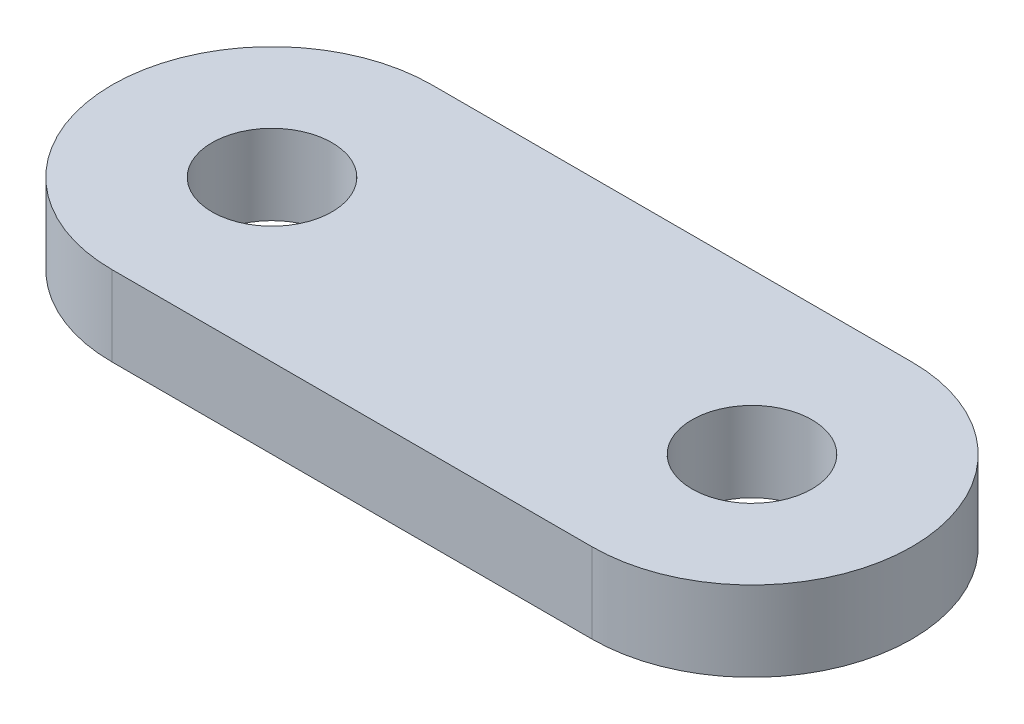
ISO-10303-21;
HEADER;
FILE_DESCRIPTION(('STEP AP214'),'2;1');
FILE_NAME('part.step','',(''),(''),'','','');
FILE_SCHEMA(('AUTOMOTIVE_DESIGN { 1 0 10303 214 1 1 1 1 }'));
ENDSEC;
DATA;
#1=APPLICATION_CONTEXT('core data for automotive mechanical design processes');
#2=APPLICATION_PROTOCOL_DEFINITION('international standard','automotive_design',2000,#1);
#3=PRODUCT_CONTEXT('',#1,'mechanical');
#4=PRODUCT('Part','Part','',(#3));
#5=PRODUCT_RELATED_PRODUCT_CATEGORY('part','',(#4));
#6=PRODUCT_DEFINITION_FORMATION('','',#4);
#7=PRODUCT_DEFINITION_CONTEXT('part definition',#1,'design');
#8=PRODUCT_DEFINITION('design','',#6,#7);
#9=PRODUCT_DEFINITION_SHAPE('','',#8);
#10=(LENGTH_UNIT() NAMED_UNIT(*) SI_UNIT(.MILLI.,.METRE.));
#11=(NAMED_UNIT(*) PLANE_ANGLE_UNIT() SI_UNIT($,.RADIAN.));
#12=(NAMED_UNIT(*) SI_UNIT($,.STERADIAN.) SOLID_ANGLE_UNIT());
#13=UNCERTAINTY_MEASURE_WITH_UNIT(LENGTH_MEASURE(1.E-05),#10,'distance_accuracy_value','');
#14=(GEOMETRIC_REPRESENTATION_CONTEXT(3) GLOBAL_UNCERTAINTY_ASSIGNED_CONTEXT((#13)) GLOBAL_UNIT_ASSIGNED_CONTEXT((#10,
#11,#12)) REPRESENTATION_CONTEXT('',''));
#15=CARTESIAN_POINT('',(0.,0.,0.));
#16=DIRECTION('',(0.,0.,1.));
#17=DIRECTION('',(1.,0.,0.));
#18=AXIS2_PLACEMENT_3D('',#15,#16,#17);
#19=CARTESIAN_POINT('',(-30.,10.,0.));
#20=DIRECTION('',(0.,1.,0.));
#21=DIRECTION('',(0.,0.,1.));
#22=AXIS2_PLACEMENT_3D('',#19,#20,#21);
#23=PLANE('',#22);
#24=CARTESIAN_POINT('',(-30.,10.,0.));
#25=DIRECTION('',(0.,1.,0.));
#26=DIRECTION('',(0.,0.,1.));
#27=AXIS2_PLACEMENT_3D('',#24,#25,#26);
#28=CIRCLE('',#27,7.5);
#29=CARTESIAN_POINT('',(-30.,10.,7.5));
#30=VERTEX_POINT('',#29);
#31=EDGE_CURVE('E103',#30,#30,#28,.T.);
#32=ORIENTED_EDGE('',*,*,#31,.F.);
#33=EDGE_LOOP('',(#32));
#34=FACE_BOUND('',#33,.T.);
#35=CARTESIAN_POINT('',(-30.,10.,0.));
#36=DIRECTION('',(0.,1.,0.));
#37=DIRECTION('',(0.,0.,1.));
#38=AXIS2_PLACEMENT_3D('',#35,#36,#37);
#39=CIRCLE('',#38,20.);
#40=CARTESIAN_POINT('',(-30.,10.,-20.));
#41=VERTEX_POINT('',#40);
#42=CARTESIAN_POINT('',(-30.,10.,20.));
#43=VERTEX_POINT('',#42);
#44=EDGE_CURVE('E88',#41,#43,#39,.T.);
#45=ORIENTED_EDGE('',*,*,#44,.T.);
#46=DIRECTION('',(1.,0.,0.));
#47=VECTOR('',#46,1.);
#48=CARTESIAN_POINT('',(30.,10.,20.));
#49=LINE('',#48,#47);
#50=CARTESIAN_POINT('',(30.,10.,20.));
#51=VERTEX_POINT('',#50);
#52=EDGE_CURVE('E83',#43,#51,#49,.T.);
#53=ORIENTED_EDGE('',*,*,#52,.T.);
#54=CARTESIAN_POINT('',(30.,10.,0.));
#55=DIRECTION('',(0.,1.,0.));
#56=DIRECTION('',(0.,0.,1.));
#57=AXIS2_PLACEMENT_3D('',#54,#55,#56);
#58=CIRCLE('',#57,20.);
#59=CARTESIAN_POINT('',(30.,10.,-20.));
#60=VERTEX_POINT('',#59);
#61=EDGE_CURVE('E86',#51,#60,#58,.T.);
#62=ORIENTED_EDGE('',*,*,#61,.T.);
#63=DIRECTION('',(-1.,0.,0.));
#64=VECTOR('',#63,1.);
#65=CARTESIAN_POINT('',(30.,10.,-20.));
#66=LINE('',#65,#64);
#67=EDGE_CURVE('E53',#60,#41,#66,.T.);
#68=ORIENTED_EDGE('',*,*,#67,.T.);
#69=EDGE_LOOP('',(#45,#53,#62,#68));
#70=FACE_BOUND('',#69,.T.);
#71=CARTESIAN_POINT('',(30.,10.,0.));
#72=DIRECTION('',(0.,1.,0.));
#73=DIRECTION('',(0.,0.,1.));
#74=AXIS2_PLACEMENT_3D('',#71,#72,#73);
#75=CIRCLE('',#74,7.5);
#76=CARTESIAN_POINT('',(30.,10.,7.5));
#77=VERTEX_POINT('',#76);
#78=EDGE_CURVE('E118',#77,#77,#75,.T.);
#79=ORIENTED_EDGE('',*,*,#78,.F.);
#80=EDGE_LOOP('',(#79));
#81=FACE_BOUND('',#80,.T.);
#82=ADVANCED_FACE('F36',(#34,#70,#81),#23,.T.);
#83=CARTESIAN_POINT('',(-30.,0.,0.));
#84=DIRECTION('',(0.,1.,0.));
#85=DIRECTION('',(0.,0.,1.));
#86=AXIS2_PLACEMENT_3D('',#83,#84,#85);
#87=PLANE('',#86);
#88=CARTESIAN_POINT('',(-30.,0.,0.));
#89=DIRECTION('',(0.,1.,0.));
#90=DIRECTION('',(0.,0.,1.));
#91=AXIS2_PLACEMENT_3D('',#88,#89,#90);
#92=CIRCLE('',#91,20.);
#93=CARTESIAN_POINT('',(-30.,0.,-20.));
#94=VERTEX_POINT('',#93);
#95=CARTESIAN_POINT('',(-30.,0.,20.));
#96=VERTEX_POINT('',#95);
#97=EDGE_CURVE('E100',#94,#96,#92,.T.);
#98=ORIENTED_EDGE('',*,*,#97,.F.);
#99=DIRECTION('',(-1.,0.,0.));
#100=VECTOR('',#99,1.);
#101=CARTESIAN_POINT('',(30.,0.,-20.));
#102=LINE('',#101,#100);
#103=CARTESIAN_POINT('',(30.,0.,-20.));
#104=VERTEX_POINT('',#103);
#105=EDGE_CURVE('E76',#104,#94,#102,.T.);
#106=ORIENTED_EDGE('',*,*,#105,.F.);
#107=CARTESIAN_POINT('',(30.,0.,0.));
#108=DIRECTION('',(0.,1.,0.));
#109=DIRECTION('',(0.,0.,1.));
#110=AXIS2_PLACEMENT_3D('',#107,#108,#109);
#111=CIRCLE('',#110,20.);
#112=CARTESIAN_POINT('',(30.,0.,20.));
#113=VERTEX_POINT('',#112);
#114=EDGE_CURVE('E70',#113,#104,#111,.T.);
#115=ORIENTED_EDGE('',*,*,#114,.F.);
#116=DIRECTION('',(1.,0.,0.));
#117=VECTOR('',#116,1.);
#118=CARTESIAN_POINT('',(30.,0.,20.));
#119=LINE('',#118,#117);
#120=EDGE_CURVE('E92',#96,#113,#119,.T.);
#121=ORIENTED_EDGE('',*,*,#120,.F.);
#122=EDGE_LOOP('',(#98,#106,#115,#121));
#123=FACE_BOUND('',#122,.T.);
#124=CARTESIAN_POINT('',(-30.,0.,0.));
#125=DIRECTION('',(0.,1.,0.));
#126=DIRECTION('',(0.,0.,1.));
#127=AXIS2_PLACEMENT_3D('',#124,#125,#126);
#128=CIRCLE('',#127,7.5);
#129=CARTESIAN_POINT('',(-30.,0.,7.5));
#130=VERTEX_POINT('',#129);
#131=EDGE_CURVE('E115',#130,#130,#128,.T.);
#132=ORIENTED_EDGE('',*,*,#131,.T.);
#133=EDGE_LOOP('',(#132));
#134=FACE_BOUND('',#133,.T.);
#135=CARTESIAN_POINT('',(30.,0.,0.));
#136=DIRECTION('',(0.,1.,0.));
#137=DIRECTION('',(0.,0.,1.));
#138=AXIS2_PLACEMENT_3D('',#135,#136,#137);
#139=CIRCLE('',#138,7.5);
#140=CARTESIAN_POINT('',(30.,0.,7.5));
#141=VERTEX_POINT('',#140);
#142=EDGE_CURVE('E121',#141,#141,#139,.T.);
#143=ORIENTED_EDGE('',*,*,#142,.T.);
#144=EDGE_LOOP('',(#143));
#145=FACE_BOUND('',#144,.T.);
#146=ADVANCED_FACE('F111',(#123,#134,#145),#87,.F.);
#147=CARTESIAN_POINT('',(-30.,10.,0.));
#148=DIRECTION('',(0.,-1.,0.));
#149=DIRECTION('',(0.,0.,-1.));
#150=AXIS2_PLACEMENT_3D('',#147,#148,#149);
#151=CYLINDRICAL_SURFACE('',#150,20.);
#152=ORIENTED_EDGE('',*,*,#97,.T.);
#153=DIRECTION('',(0.,-1.,0.));
#154=VECTOR('',#153,1.);
#155=CARTESIAN_POINT('',(-30.,10.,20.));
#156=LINE('',#155,#154);
#157=EDGE_CURVE('E11',#43,#96,#156,.T.);
#158=ORIENTED_EDGE('',*,*,#157,.F.);
#159=ORIENTED_EDGE('',*,*,#44,.F.);
#160=DIRECTION('',(0.,-1.,0.));
#161=VECTOR('',#160,1.);
#162=CARTESIAN_POINT('',(-30.,10.,-20.));
#163=LINE('',#162,#161);
#164=EDGE_CURVE('E96',#41,#94,#163,.T.);
#165=ORIENTED_EDGE('',*,*,#164,.T.);
#166=EDGE_LOOP('',(#152,#158,#159,#165));
#167=FACE_BOUND('',#166,.T.);
#168=ADVANCED_FACE('F38',(#167),#151,.T.);
#169=CARTESIAN_POINT('',(30.,10.,20.));
#170=DIRECTION('',(0.,0.,-1.));
#171=DIRECTION('',(-1.,0.,0.));
#172=AXIS2_PLACEMENT_3D('',#169,#170,#171);
#173=PLANE('',#172);
#174=ORIENTED_EDGE('',*,*,#120,.T.);
#175=DIRECTION('',(0.,-1.,0.));
#176=VECTOR('',#175,1.);
#177=CARTESIAN_POINT('',(30.,10.,20.));
#178=LINE('',#177,#176);
#179=EDGE_CURVE('E45',#51,#113,#178,.T.);
#180=ORIENTED_EDGE('',*,*,#179,.F.);
#181=ORIENTED_EDGE('',*,*,#52,.F.);
#182=ORIENTED_EDGE('',*,*,#157,.T.);
#183=EDGE_LOOP('',(#174,#180,#181,#182));
#184=FACE_BOUND('',#183,.T.);
#185=ADVANCED_FACE('F91',(#184),#173,.F.);
#186=CARTESIAN_POINT('',(30.,10.,0.));
#187=DIRECTION('',(0.,-1.,0.));
#188=DIRECTION('',(0.,0.,-1.));
#189=AXIS2_PLACEMENT_3D('',#186,#187,#188);
#190=CYLINDRICAL_SURFACE('',#189,20.);
#191=ORIENTED_EDGE('',*,*,#114,.T.);
#192=DIRECTION('',(0.,-1.,0.));
#193=VECTOR('',#192,1.);
#194=CARTESIAN_POINT('',(30.,10.,-20.));
#195=LINE('',#194,#193);
#196=EDGE_CURVE('E93',#60,#104,#195,.T.);
#197=ORIENTED_EDGE('',*,*,#196,.F.);
#198=ORIENTED_EDGE('',*,*,#61,.F.);
#199=ORIENTED_EDGE('',*,*,#179,.T.);
#200=EDGE_LOOP('',(#191,#197,#198,#199));
#201=FACE_BOUND('',#200,.T.);
#202=ADVANCED_FACE('F94',(#201),#190,.T.);
#203=CARTESIAN_POINT('',(30.,10.,-20.));
#204=DIRECTION('',(0.,0.,1.));
#205=DIRECTION('',(1.,0.,0.));
#206=AXIS2_PLACEMENT_3D('',#203,#204,#205);
#207=PLANE('',#206);
#208=ORIENTED_EDGE('',*,*,#105,.T.);
#209=ORIENTED_EDGE('',*,*,#164,.F.);
#210=ORIENTED_EDGE('',*,*,#67,.F.);
#211=ORIENTED_EDGE('',*,*,#196,.T.);
#212=EDGE_LOOP('',(#208,#209,#210,#211));
#213=FACE_BOUND('',#212,.T.);
#214=ADVANCED_FACE('F108',(#213),#207,.F.);
#215=CARTESIAN_POINT('',(-30.,10.,0.));
#216=DIRECTION('',(0.,-1.,0.));
#217=DIRECTION('',(0.,0.,-1.));
#218=AXIS2_PLACEMENT_3D('',#215,#216,#217);
#219=CYLINDRICAL_SURFACE('',#218,7.5);
#220=ORIENTED_EDGE('',*,*,#31,.T.);
#221=EDGE_LOOP('',(#220));
#222=FACE_BOUND('',#221,.T.);
#223=ORIENTED_EDGE('',*,*,#131,.F.);
#224=EDGE_LOOP('',(#223));
#225=FACE_BOUND('',#224,.T.);
#226=ADVANCED_FACE('F138',(#222,#225),#219,.F.);
#227=CARTESIAN_POINT('',(30.,10.,0.));
#228=DIRECTION('',(0.,-1.,0.));
#229=DIRECTION('',(0.,0.,-1.));
#230=AXIS2_PLACEMENT_3D('',#227,#228,#229);
#231=CYLINDRICAL_SURFACE('',#230,7.5);
#232=ORIENTED_EDGE('',*,*,#78,.T.);
#233=EDGE_LOOP('',(#232));
#234=FACE_BOUND('',#233,.T.);
#235=ORIENTED_EDGE('',*,*,#142,.F.);
#236=EDGE_LOOP('',(#235));
#237=FACE_BOUND('',#236,.T.);
#238=ADVANCED_FACE('F127',(#234,#237),#231,.F.);
#239=CLOSED_SHELL('',(#82,#146,#168,#185,#202,#214,#226,#238));
#240=MANIFOLD_SOLID_BREP('B2',#239);
#241=ADVANCED_BREP_SHAPE_REPRESENTATION('',(#18,#240),#14);
#242=SHAPE_DEFINITION_REPRESENTATION(#9,#241);
ENDSEC;
END-ISO-10303-21;
